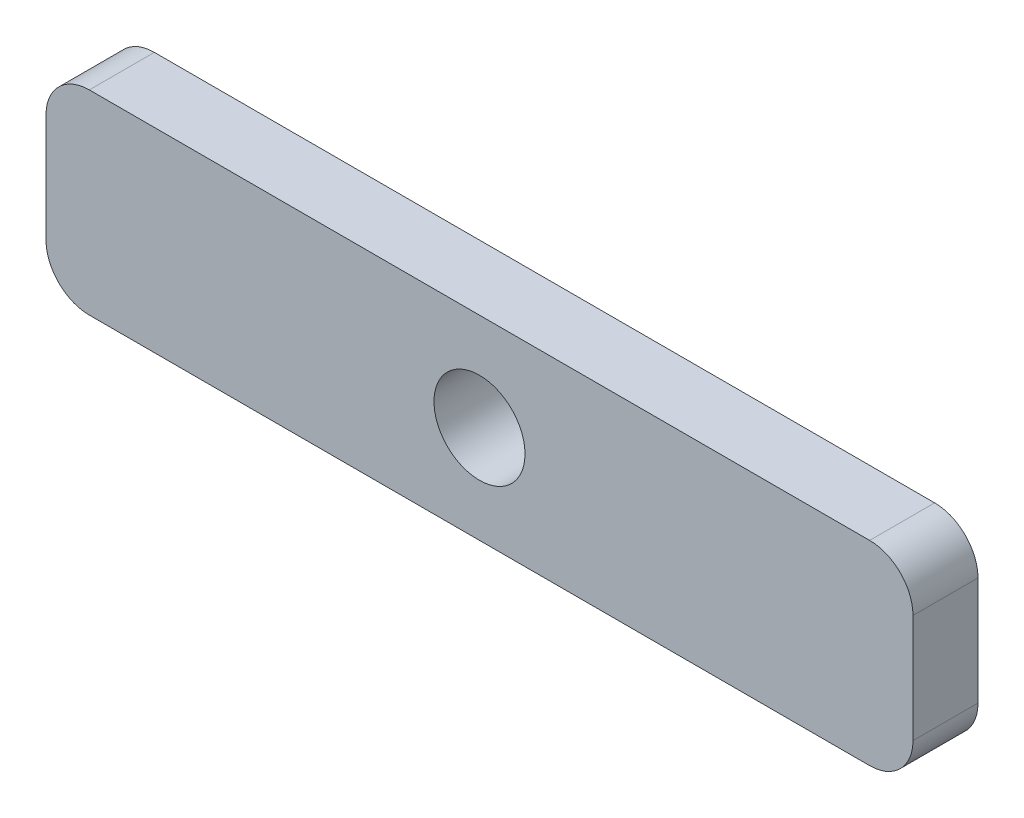
ISO-10303-21;
HEADER;
FILE_DESCRIPTION(('STEP AP214'),'2;1');
FILE_NAME('part.step','',(''),(''),'','','');
FILE_SCHEMA(('AUTOMOTIVE_DESIGN { 1 0 10303 214 1 1 1 1 }'));
ENDSEC;
DATA;
#1=APPLICATION_CONTEXT('core data for automotive mechanical design processes');
#2=APPLICATION_PROTOCOL_DEFINITION('international standard','automotive_design',2000,#1);
#3=PRODUCT_CONTEXT('',#1,'mechanical');
#4=PRODUCT('Part','Part','',(#3));
#5=PRODUCT_RELATED_PRODUCT_CATEGORY('part','',(#4));
#6=PRODUCT_DEFINITION_FORMATION('','',#4);
#7=PRODUCT_DEFINITION_CONTEXT('part definition',#1,'design');
#8=PRODUCT_DEFINITION('design','',#6,#7);
#9=PRODUCT_DEFINITION_SHAPE('','',#8);
#10=(LENGTH_UNIT() NAMED_UNIT(*) SI_UNIT(.MILLI.,.METRE.));
#11=(NAMED_UNIT(*) PLANE_ANGLE_UNIT() SI_UNIT($,.RADIAN.));
#12=(NAMED_UNIT(*) SI_UNIT($,.STERADIAN.) SOLID_ANGLE_UNIT());
#13=UNCERTAINTY_MEASURE_WITH_UNIT(LENGTH_MEASURE(1.E-05),#10,'distance_accuracy_value','');
#14=(GEOMETRIC_REPRESENTATION_CONTEXT(3) GLOBAL_UNCERTAINTY_ASSIGNED_CONTEXT((#13)) GLOBAL_UNIT_ASSIGNED_CONTEXT((#10,
#11,#12)) REPRESENTATION_CONTEXT('',''));
#15=CARTESIAN_POINT('',(0.,0.,0.));
#16=DIRECTION('',(0.,0.,1.));
#17=DIRECTION('',(1.,0.,0.));
#18=AXIS2_PLACEMENT_3D('',#15,#16,#17);
#19=CARTESIAN_POINT('',(0.,0.,3.));
#20=DIRECTION('',(0.,0.,1.));
#21=DIRECTION('',(1.,0.,0.));
#22=AXIS2_PLACEMENT_3D('',#19,#20,#21);
#23=PLANE('',#22);
#24=DIRECTION('',(1.,0.,0.));
#25=VECTOR('',#24,1.);
#26=CARTESIAN_POINT('',(-20.,-4.5,3.));
#27=LINE('',#26,#25);
#28=CARTESIAN_POINT('',(-18.,-4.5,3.));
#29=VERTEX_POINT('',#28);
#30=CARTESIAN_POINT('',(18.,-4.5,3.));
#31=VERTEX_POINT('',#30);
#32=EDGE_CURVE('E174',#29,#31,#27,.T.);
#33=ORIENTED_EDGE('',*,*,#32,.T.);
#34=CARTESIAN_POINT('',(18.,-2.5,3.));
#35=DIRECTION('',(0.,0.,1.));
#36=DIRECTION('',(1.,0.,0.));
#37=AXIS2_PLACEMENT_3D('',#34,#35,#36);
#38=CIRCLE('',#37,2.);
#39=CARTESIAN_POINT('',(20.,-2.5,3.));
#40=VERTEX_POINT('',#39);
#41=EDGE_CURVE('E154',#31,#40,#38,.T.);
#42=ORIENTED_EDGE('',*,*,#41,.T.);
#43=DIRECTION('',(0.,1.,0.));
#44=VECTOR('',#43,1.);
#45=CARTESIAN_POINT('',(20.,4.5,3.));
#46=LINE('',#45,#44);
#47=CARTESIAN_POINT('',(20.,2.5,3.));
#48=VERTEX_POINT('',#47);
#49=EDGE_CURVE('E124',#40,#48,#46,.T.);
#50=ORIENTED_EDGE('',*,*,#49,.T.);
#51=CARTESIAN_POINT('',(18.,2.5,3.));
#52=DIRECTION('',(0.,0.,1.));
#53=DIRECTION('',(1.,0.,0.));
#54=AXIS2_PLACEMENT_3D('',#51,#52,#53);
#55=CIRCLE('',#54,2.);
#56=CARTESIAN_POINT('',(18.,4.5,3.));
#57=VERTEX_POINT('',#56);
#58=EDGE_CURVE('E60',#48,#57,#55,.T.);
#59=ORIENTED_EDGE('',*,*,#58,.T.);
#60=DIRECTION('',(-1.,0.,0.));
#61=VECTOR('',#60,1.);
#62=CARTESIAN_POINT('',(-20.,4.5,3.));
#63=LINE('',#62,#61);
#64=CARTESIAN_POINT('',(-18.,4.5,3.));
#65=VERTEX_POINT('',#64);
#66=EDGE_CURVE('E141',#57,#65,#63,.T.);
#67=ORIENTED_EDGE('',*,*,#66,.T.);
#68=CARTESIAN_POINT('',(-18.,2.5,3.));
#69=DIRECTION('',(0.,0.,1.));
#70=DIRECTION('',(1.,0.,0.));
#71=AXIS2_PLACEMENT_3D('',#68,#69,#70);
#72=CIRCLE('',#71,2.);
#73=CARTESIAN_POINT('',(-20.,2.5,3.));
#74=VERTEX_POINT('',#73);
#75=EDGE_CURVE('E149',#65,#74,#72,.T.);
#76=ORIENTED_EDGE('',*,*,#75,.T.);
#77=DIRECTION('',(0.,-1.,0.));
#78=VECTOR('',#77,1.);
#79=CARTESIAN_POINT('',(-20.,4.5,3.));
#80=LINE('',#79,#78);
#81=CARTESIAN_POINT('',(-20.,-2.5,3.));
#82=VERTEX_POINT('',#81);
#83=EDGE_CURVE('E135',#74,#82,#80,.T.);
#84=ORIENTED_EDGE('',*,*,#83,.T.);
#85=CARTESIAN_POINT('',(-18.,-2.5,3.));
#86=DIRECTION('',(0.,0.,1.));
#87=DIRECTION('',(1.,0.,0.));
#88=AXIS2_PLACEMENT_3D('',#85,#86,#87);
#89=CIRCLE('',#88,2.);
#90=EDGE_CURVE('E152',#82,#29,#89,.T.);
#91=ORIENTED_EDGE('',*,*,#90,.T.);
#92=EDGE_LOOP('',(#33,#42,#50,#59,#67,#76,#84,#91));
#93=FACE_BOUND('',#92,.T.);
#94=CARTESIAN_POINT('',(0.,0.,3.));
#95=DIRECTION('',(0.,0.,1.));
#96=DIRECTION('',(1.,0.,0.));
#97=AXIS2_PLACEMENT_3D('',#94,#95,#96);
#98=CIRCLE('',#97,2.1);
#99=CARTESIAN_POINT('',(2.10000000000001,0.,3.));
#100=VERTEX_POINT('',#99);
#101=EDGE_CURVE('E180',#100,#100,#98,.T.);
#102=ORIENTED_EDGE('',*,*,#101,.F.);
#103=EDGE_LOOP('',(#102));
#104=FACE_BOUND('',#103,.T.);
#105=ADVANCED_FACE('F39',(#93,#104),#23,.T.);
#106=CARTESIAN_POINT('',(0.,0.,0.));
#107=DIRECTION('',(0.,0.,1.));
#108=DIRECTION('',(1.,0.,0.));
#109=AXIS2_PLACEMENT_3D('',#106,#107,#108);
#110=PLANE('',#109);
#111=DIRECTION('',(0.,1.,0.));
#112=VECTOR('',#111,1.);
#113=CARTESIAN_POINT('',(20.,4.5,0.));
#114=LINE('',#113,#112);
#115=CARTESIAN_POINT('',(20.,-2.5,0.));
#116=VERTEX_POINT('',#115);
#117=CARTESIAN_POINT('',(20.,2.5,0.));
#118=VERTEX_POINT('',#117);
#119=EDGE_CURVE('E122',#116,#118,#114,.T.);
#120=ORIENTED_EDGE('',*,*,#119,.F.);
#121=CARTESIAN_POINT('',(18.,-2.5,0.));
#122=DIRECTION('',(0.,0.,1.));
#123=DIRECTION('',(1.,0.,0.));
#124=AXIS2_PLACEMENT_3D('',#121,#122,#123);
#125=CIRCLE('',#124,2.);
#126=CARTESIAN_POINT('',(18.,-4.5,0.));
#127=VERTEX_POINT('',#126);
#128=EDGE_CURVE('E105',#116,#127,#125,.F.);
#129=ORIENTED_EDGE('',*,*,#128,.T.);
#130=DIRECTION('',(1.,0.,0.));
#131=VECTOR('',#130,1.);
#132=CARTESIAN_POINT('',(-20.,-4.5,0.));
#133=LINE('',#132,#131);
#134=CARTESIAN_POINT('',(-18.,-4.5,0.));
#135=VERTEX_POINT('',#134);
#136=EDGE_CURVE('E133',#135,#127,#133,.T.);
#137=ORIENTED_EDGE('',*,*,#136,.F.);
#138=CARTESIAN_POINT('',(-18.,-2.5,0.));
#139=DIRECTION('',(0.,0.,1.));
#140=DIRECTION('',(1.,0.,0.));
#141=AXIS2_PLACEMENT_3D('',#138,#139,#140);
#142=CIRCLE('',#141,2.);
#143=CARTESIAN_POINT('',(-20.,-2.5,0.));
#144=VERTEX_POINT('',#143);
#145=EDGE_CURVE('E116',#135,#144,#142,.F.);
#146=ORIENTED_EDGE('',*,*,#145,.T.);
#147=DIRECTION('',(0.,-1.,0.));
#148=VECTOR('',#147,1.);
#149=CARTESIAN_POINT('',(-20.,4.5,0.));
#150=LINE('',#149,#148);
#151=CARTESIAN_POINT('',(-20.,2.5,0.));
#152=VERTEX_POINT('',#151);
#153=EDGE_CURVE('E137',#152,#144,#150,.T.);
#154=ORIENTED_EDGE('',*,*,#153,.F.);
#155=CARTESIAN_POINT('',(-18.,2.5,0.));
#156=DIRECTION('',(0.,0.,1.));
#157=DIRECTION('',(1.,0.,0.));
#158=AXIS2_PLACEMENT_3D('',#155,#156,#157);
#159=CIRCLE('',#158,2.);
#160=CARTESIAN_POINT('',(-18.,4.5,0.));
#161=VERTEX_POINT('',#160);
#162=EDGE_CURVE('E125',#152,#161,#159,.F.);
#163=ORIENTED_EDGE('',*,*,#162,.T.);
#164=DIRECTION('',(-1.,0.,0.));
#165=VECTOR('',#164,1.);
#166=CARTESIAN_POINT('',(-20.,4.5,0.));
#167=LINE('',#166,#165);
#168=CARTESIAN_POINT('',(18.,4.5,0.));
#169=VERTEX_POINT('',#168);
#170=EDGE_CURVE('E132',#169,#161,#167,.T.);
#171=ORIENTED_EDGE('',*,*,#170,.F.);
#172=CARTESIAN_POINT('',(18.,2.5,0.));
#173=DIRECTION('',(0.,0.,1.));
#174=DIRECTION('',(1.,0.,0.));
#175=AXIS2_PLACEMENT_3D('',#172,#173,#174);
#176=CIRCLE('',#175,2.);
#177=EDGE_CURVE('E131',#169,#118,#176,.F.);
#178=ORIENTED_EDGE('',*,*,#177,.T.);
#179=EDGE_LOOP('',(#120,#129,#137,#146,#154,#163,#171,#178));
#180=FACE_BOUND('',#179,.T.);
#181=CARTESIAN_POINT('',(0.,0.,0.));
#182=DIRECTION('',(0.,0.,1.));
#183=DIRECTION('',(1.,0.,0.));
#184=AXIS2_PLACEMENT_3D('',#181,#182,#183);
#185=CIRCLE('',#184,2.1);
#186=CARTESIAN_POINT('',(2.10000000000001,0.,0.));
#187=VERTEX_POINT('',#186);
#188=EDGE_CURVE('E182',#187,#187,#185,.T.);
#189=ORIENTED_EDGE('',*,*,#188,.T.);
#190=EDGE_LOOP('',(#189));
#191=FACE_BOUND('',#190,.T.);
#192=ADVANCED_FACE('F128',(#180,#191),#110,.F.);
#193=CARTESIAN_POINT('',(-20.,4.5,3.));
#194=DIRECTION('',(1.,0.,0.));
#195=DIRECTION('',(0.,0.,-1.));
#196=AXIS2_PLACEMENT_3D('',#193,#194,#195);
#197=PLANE('',#196);
#198=ORIENTED_EDGE('',*,*,#153,.T.);
#199=DIRECTION('',(0.,0.,-1.));
#200=VECTOR('',#199,1.);
#201=CARTESIAN_POINT('',(-20.,-2.5,3.));
#202=LINE('',#201,#200);
#203=EDGE_CURVE('E159',#144,#82,#202,.F.);
#204=ORIENTED_EDGE('',*,*,#203,.T.);
#205=ORIENTED_EDGE('',*,*,#83,.F.);
#206=DIRECTION('',(0.,0.,-1.));
#207=VECTOR('',#206,1.);
#208=CARTESIAN_POINT('',(-20.,2.5,3.));
#209=LINE('',#208,#207);
#210=EDGE_CURVE('E156',#74,#152,#209,.T.);
#211=ORIENTED_EDGE('',*,*,#210,.T.);
#212=EDGE_LOOP('',(#198,#204,#205,#211));
#213=FACE_BOUND('',#212,.T.);
#214=ADVANCED_FACE('F165',(#213),#197,.F.);
#215=CARTESIAN_POINT('',(-20.,-4.5,3.));
#216=DIRECTION('',(0.,1.,0.));
#217=DIRECTION('',(0.,0.,1.));
#218=AXIS2_PLACEMENT_3D('',#215,#216,#217);
#219=PLANE('',#218);
#220=ORIENTED_EDGE('',*,*,#136,.T.);
#221=DIRECTION('',(0.,0.,-1.));
#222=VECTOR('',#221,1.);
#223=CARTESIAN_POINT('',(18.,-4.5,3.));
#224=LINE('',#223,#222);
#225=EDGE_CURVE('E110',#127,#31,#224,.F.);
#226=ORIENTED_EDGE('',*,*,#225,.T.);
#227=ORIENTED_EDGE('',*,*,#32,.F.);
#228=DIRECTION('',(0.,0.,-1.));
#229=VECTOR('',#228,1.);
#230=CARTESIAN_POINT('',(-18.,-4.5,3.));
#231=LINE('',#230,#229);
#232=EDGE_CURVE('E115',#29,#135,#231,.T.);
#233=ORIENTED_EDGE('',*,*,#232,.T.);
#234=EDGE_LOOP('',(#220,#226,#227,#233));
#235=FACE_BOUND('',#234,.T.);
#236=ADVANCED_FACE('F179',(#235),#219,.F.);
#237=CARTESIAN_POINT('',(20.,4.5,3.));
#238=DIRECTION('',(-1.,0.,0.));
#239=DIRECTION('',(0.,-1.,0.));
#240=AXIS2_PLACEMENT_3D('',#237,#238,#239);
#241=PLANE('',#240);
#242=ORIENTED_EDGE('',*,*,#49,.F.);
#243=DIRECTION('',(0.,0.,-1.));
#244=VECTOR('',#243,1.);
#245=CARTESIAN_POINT('',(20.,-2.5,3.));
#246=LINE('',#245,#244);
#247=EDGE_CURVE('E109',#40,#116,#246,.T.);
#248=ORIENTED_EDGE('',*,*,#247,.T.);
#249=ORIENTED_EDGE('',*,*,#119,.T.);
#250=DIRECTION('',(0.,0.,-1.));
#251=VECTOR('',#250,1.);
#252=CARTESIAN_POINT('',(20.,2.5,3.));
#253=LINE('',#252,#251);
#254=EDGE_CURVE('E126',#118,#48,#253,.F.);
#255=ORIENTED_EDGE('',*,*,#254,.T.);
#256=EDGE_LOOP('',(#242,#248,#249,#255));
#257=FACE_BOUND('',#256,.T.);
#258=ADVANCED_FACE('F121',(#257),#241,.F.);
#259=CARTESIAN_POINT('',(-20.,4.5,3.));
#260=DIRECTION('',(0.,-1.,0.));
#261=DIRECTION('',(0.,0.,-1.));
#262=AXIS2_PLACEMENT_3D('',#259,#260,#261);
#263=PLANE('',#262);
#264=ORIENTED_EDGE('',*,*,#66,.F.);
#265=DIRECTION('',(0.,0.,-1.));
#266=VECTOR('',#265,1.);
#267=CARTESIAN_POINT('',(18.,4.5,3.));
#268=LINE('',#267,#266);
#269=EDGE_CURVE('E11',#57,#169,#268,.T.);
#270=ORIENTED_EDGE('',*,*,#269,.T.);
#271=ORIENTED_EDGE('',*,*,#170,.T.);
#272=DIRECTION('',(0.,0.,-1.));
#273=VECTOR('',#272,1.);
#274=CARTESIAN_POINT('',(-18.,4.5,3.));
#275=LINE('',#274,#273);
#276=EDGE_CURVE('E47',#161,#65,#275,.F.);
#277=ORIENTED_EDGE('',*,*,#276,.T.);
#278=EDGE_LOOP('',(#264,#270,#271,#277));
#279=FACE_BOUND('',#278,.T.);
#280=ADVANCED_FACE('F193',(#279),#263,.F.);
#281=CARTESIAN_POINT('',(0.,0.,3.));
#282=DIRECTION('',(0.,0.,-1.));
#283=DIRECTION('',(-1.,0.,0.));
#284=AXIS2_PLACEMENT_3D('',#281,#282,#283);
#285=CYLINDRICAL_SURFACE('',#284,2.1);
#286=ORIENTED_EDGE('',*,*,#101,.T.);
#287=EDGE_LOOP('',(#286));
#288=FACE_BOUND('',#287,.T.);
#289=ORIENTED_EDGE('',*,*,#188,.F.);
#290=EDGE_LOOP('',(#289));
#291=FACE_BOUND('',#290,.T.);
#292=ADVANCED_FACE('F191',(#288,#291),#285,.F.);
#293=CARTESIAN_POINT('',(18.,-2.5,3.));
#294=DIRECTION('',(0.,0.,-1.));
#295=DIRECTION('',(-1.,0.,0.));
#296=AXIS2_PLACEMENT_3D('',#293,#294,#295);
#297=CYLINDRICAL_SURFACE('',#296,2.);
#298=ORIENTED_EDGE('',*,*,#41,.F.);
#299=ORIENTED_EDGE('',*,*,#225,.F.);
#300=ORIENTED_EDGE('',*,*,#128,.F.);
#301=ORIENTED_EDGE('',*,*,#247,.F.);
#302=EDGE_LOOP('',(#298,#299,#300,#301));
#303=FACE_BOUND('',#302,.T.);
#304=ADVANCED_FACE('F108',(#303),#297,.T.);
#305=CARTESIAN_POINT('',(-18.,-2.5,3.));
#306=DIRECTION('',(0.,0.,-1.));
#307=DIRECTION('',(-1.,0.,0.));
#308=AXIS2_PLACEMENT_3D('',#305,#306,#307);
#309=CYLINDRICAL_SURFACE('',#308,2.);
#310=ORIENTED_EDGE('',*,*,#90,.F.);
#311=ORIENTED_EDGE('',*,*,#203,.F.);
#312=ORIENTED_EDGE('',*,*,#145,.F.);
#313=ORIENTED_EDGE('',*,*,#232,.F.);
#314=EDGE_LOOP('',(#310,#311,#312,#313));
#315=FACE_BOUND('',#314,.T.);
#316=ADVANCED_FACE('F177',(#315),#309,.T.);
#317=CARTESIAN_POINT('',(18.,2.5,3.));
#318=DIRECTION('',(0.,0.,-1.));
#319=DIRECTION('',(-1.,0.,0.));
#320=AXIS2_PLACEMENT_3D('',#317,#318,#319);
#321=CYLINDRICAL_SURFACE('',#320,2.);
#322=ORIENTED_EDGE('',*,*,#58,.F.);
#323=ORIENTED_EDGE('',*,*,#254,.F.);
#324=ORIENTED_EDGE('',*,*,#177,.F.);
#325=ORIENTED_EDGE('',*,*,#269,.F.);
#326=EDGE_LOOP('',(#322,#323,#324,#325));
#327=FACE_BOUND('',#326,.T.);
#328=ADVANCED_FACE('F216',(#327),#321,.T.);
#329=CARTESIAN_POINT('',(-18.,2.5,3.));
#330=DIRECTION('',(0.,0.,-1.));
#331=DIRECTION('',(-1.,0.,0.));
#332=AXIS2_PLACEMENT_3D('',#329,#330,#331);
#333=CYLINDRICAL_SURFACE('',#332,2.);
#334=ORIENTED_EDGE('',*,*,#75,.F.);
#335=ORIENTED_EDGE('',*,*,#276,.F.);
#336=ORIENTED_EDGE('',*,*,#162,.F.);
#337=ORIENTED_EDGE('',*,*,#210,.F.);
#338=EDGE_LOOP('',(#334,#335,#336,#337));
#339=FACE_BOUND('',#338,.T.);
#340=ADVANCED_FACE('F41',(#339),#333,.T.);
#341=CLOSED_SHELL('',(#105,#192,#214,#236,#258,#280,#292,#304,#316,#328,#340));
#342=MANIFOLD_SOLID_BREP('B2',#341);
#343=ADVANCED_BREP_SHAPE_REPRESENTATION('',(#18,#342),#14);
#344=SHAPE_DEFINITION_REPRESENTATION(#9,#343);
ENDSEC;
END-ISO-10303-21;
